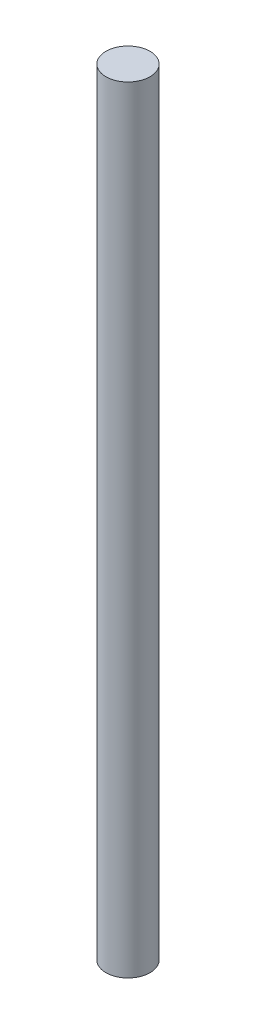
ISO-10303-21;
HEADER;
FILE_DESCRIPTION(('STEP AP214'),'2;1');
FILE_NAME('part.step','',(''),(''),'','','');
FILE_SCHEMA(('AUTOMOTIVE_DESIGN { 1 0 10303 214 1 1 1 1 }'));
ENDSEC;
DATA;
#1=APPLICATION_CONTEXT('core data for automotive mechanical design processes');
#2=APPLICATION_PROTOCOL_DEFINITION('international standard','automotive_design',2000,#1);
#3=PRODUCT_CONTEXT('',#1,'mechanical');
#4=PRODUCT('Part','Part','',(#3));
#5=PRODUCT_RELATED_PRODUCT_CATEGORY('part','',(#4));
#6=PRODUCT_DEFINITION_FORMATION('','',#4);
#7=PRODUCT_DEFINITION_CONTEXT('part definition',#1,'design');
#8=PRODUCT_DEFINITION('design','',#6,#7);
#9=PRODUCT_DEFINITION_SHAPE('','',#8);
#10=(LENGTH_UNIT() NAMED_UNIT(*) SI_UNIT(.MILLI.,.METRE.));
#11=(NAMED_UNIT(*) PLANE_ANGLE_UNIT() SI_UNIT($,.RADIAN.));
#12=(NAMED_UNIT(*) SI_UNIT($,.STERADIAN.) SOLID_ANGLE_UNIT());
#13=UNCERTAINTY_MEASURE_WITH_UNIT(LENGTH_MEASURE(1.E-05),#10,'distance_accuracy_value','');
#14=(GEOMETRIC_REPRESENTATION_CONTEXT(3) GLOBAL_UNCERTAINTY_ASSIGNED_CONTEXT((#13)) GLOBAL_UNIT_ASSIGNED_CONTEXT((#10,
#11,#12)) REPRESENTATION_CONTEXT('',''));
#15=CARTESIAN_POINT('',(0.,0.,0.));
#16=DIRECTION('',(0.,0.,1.));
#17=DIRECTION('',(1.,0.,0.));
#18=AXIS2_PLACEMENT_3D('',#15,#16,#17);
#19=CARTESIAN_POINT('',(-41.1647950147085,55.88,11.4406422822526));
#20=DIRECTION('',(0.,-1.,0.));
#21=DIRECTION('',(0.,0.,-1.));
#22=AXIS2_PLACEMENT_3D('',#19,#20,#21);
#23=CYLINDRICAL_SURFACE('',#22,1.5875);
#24=CARTESIAN_POINT('',(-41.1647950147085,55.88,11.4406422822526));
#25=DIRECTION('',(0.,1.,0.));
#26=DIRECTION('',(0.,0.,1.));
#27=AXIS2_PLACEMENT_3D('',#24,#25,#26);
#28=CIRCLE('',#27,1.5875);
#29=CARTESIAN_POINT('',(-41.1647950147085,55.88,13.0281422822526));
#30=VERTEX_POINT('',#29);
#31=EDGE_CURVE('E10',#30,#30,#28,.T.);
#32=ORIENTED_EDGE('',*,*,#31,.F.);
#33=EDGE_LOOP('',(#32));
#34=FACE_BOUND('',#33,.T.);
#35=CARTESIAN_POINT('',(-41.1647950147085,0.,11.4406422822526));
#36=DIRECTION('',(0.,1.,0.));
#37=DIRECTION('',(0.,0.,1.));
#38=AXIS2_PLACEMENT_3D('',#35,#36,#37);
#39=CIRCLE('',#38,1.5875);
#40=CARTESIAN_POINT('',(-41.1647950147085,0.,13.0281422822526));
#41=VERTEX_POINT('',#40);
#42=EDGE_CURVE('E34',#41,#41,#39,.T.);
#43=ORIENTED_EDGE('',*,*,#42,.T.);
#44=EDGE_LOOP('',(#43));
#45=FACE_BOUND('',#44,.T.);
#46=ADVANCED_FACE('F31',(#34,#45),#23,.T.);
#47=CARTESIAN_POINT('',(-41.1647950147085,55.88,11.4406422822526));
#48=DIRECTION('',(0.,1.,0.));
#49=DIRECTION('',(0.,0.,1.));
#50=AXIS2_PLACEMENT_3D('',#47,#48,#49);
#51=PLANE('',#50);
#52=ORIENTED_EDGE('',*,*,#31,.T.);
#53=EDGE_LOOP('',(#52));
#54=FACE_BOUND('',#53,.T.);
#55=ADVANCED_FACE('F46',(#54),#51,.T.);
#56=CARTESIAN_POINT('',(-41.1647950147085,0.,11.4406422822526));
#57=DIRECTION('',(0.,1.,0.));
#58=DIRECTION('',(0.,0.,1.));
#59=AXIS2_PLACEMENT_3D('',#56,#57,#58);
#60=PLANE('',#59);
#61=ORIENTED_EDGE('',*,*,#42,.F.);
#62=EDGE_LOOP('',(#61));
#63=FACE_BOUND('',#62,.T.);
#64=ADVANCED_FACE('F44',(#63),#60,.F.);
#65=CLOSED_SHELL('',(#46,#55,#64));
#66=MANIFOLD_SOLID_BREP('B2',#65);
#67=ADVANCED_BREP_SHAPE_REPRESENTATION('',(#18,#66),#14);
#68=SHAPE_DEFINITION_REPRESENTATION(#9,#67);
ENDSEC;
END-ISO-10303-21;
